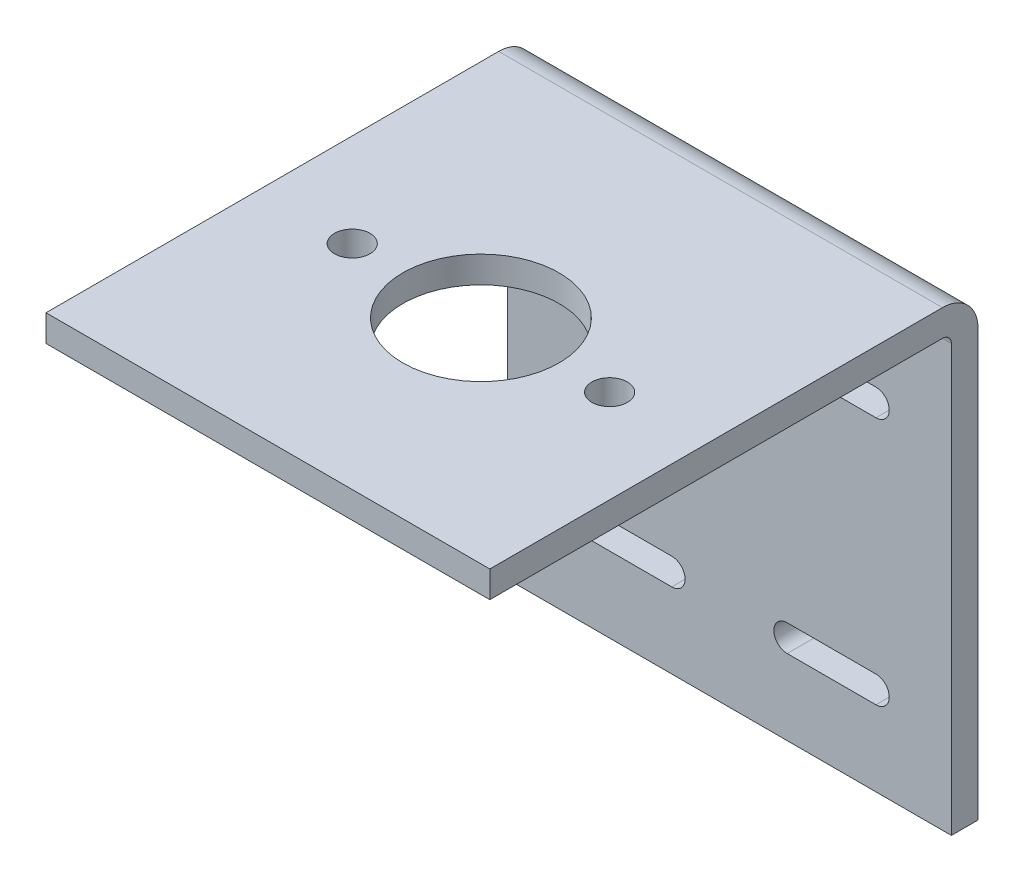
ISO-10303-21;
HEADER;
FILE_DESCRIPTION(('STEP AP214'),'2;1');
FILE_NAME('part.step','',(''),(''),'','','');
FILE_SCHEMA(('AUTOMOTIVE_DESIGN { 1 0 10303 214 1 1 1 1 }'));
ENDSEC;
DATA;
#1=APPLICATION_CONTEXT('core data for automotive mechanical design processes');
#2=APPLICATION_PROTOCOL_DEFINITION('international standard','automotive_design',2000,#1);
#3=PRODUCT_CONTEXT('',#1,'mechanical');
#4=PRODUCT('Part','Part','',(#3));
#5=PRODUCT_RELATED_PRODUCT_CATEGORY('part','',(#4));
#6=PRODUCT_DEFINITION_FORMATION('','',#4);
#7=PRODUCT_DEFINITION_CONTEXT('part definition',#1,'design');
#8=PRODUCT_DEFINITION('design','',#6,#7);
#9=PRODUCT_DEFINITION_SHAPE('','',#8);
#10=(LENGTH_UNIT() NAMED_UNIT(*) SI_UNIT(.MILLI.,.METRE.));
#11=(NAMED_UNIT(*) PLANE_ANGLE_UNIT() SI_UNIT($,.RADIAN.));
#12=(NAMED_UNIT(*) SI_UNIT($,.STERADIAN.) SOLID_ANGLE_UNIT());
#13=UNCERTAINTY_MEASURE_WITH_UNIT(LENGTH_MEASURE(1.E-05),#10,'distance_accuracy_value','');
#14=(GEOMETRIC_REPRESENTATION_CONTEXT(3) GLOBAL_UNCERTAINTY_ASSIGNED_CONTEXT((#13)) GLOBAL_UNIT_ASSIGNED_CONTEXT((#10,
#11,#12)) REPRESENTATION_CONTEXT('',''));
#15=CARTESIAN_POINT('',(0.,0.,0.));
#16=DIRECTION('',(0.,0.,1.));
#17=DIRECTION('',(1.,0.,0.));
#18=AXIS2_PLACEMENT_3D('',#15,#16,#17);
#19=CARTESIAN_POINT('',(0.,0.,3.));
#20=DIRECTION('',(0.,0.,-1.));
#21=DIRECTION('',(-1.,0.,0.));
#22=AXIS2_PLACEMENT_3D('',#19,#20,#21);
#23=PLANE('',#22);
#24=DIRECTION('',(-1.,0.,0.));
#25=VECTOR('',#24,1.);
#26=CARTESIAN_POINT('',(41.5000000000001,39.5000000000002,3.));
#27=LINE('',#26,#25);
#28=CARTESIAN_POINT('',(41.5000000000001,39.5000000000002,3.));
#29=VERTEX_POINT('',#28);
#30=CARTESIAN_POINT('',(31.5000000000001,39.5,3.));
#31=VERTEX_POINT('',#30);
#32=EDGE_CURVE('E275',#29,#31,#27,.T.);
#33=ORIENTED_EDGE('',*,*,#32,.F.);
#34=CARTESIAN_POINT('',(41.5000000000001,38.0000000000002,3.));
#35=DIRECTION('',(0.,0.,1.));
#36=DIRECTION('',(-1.,0.,0.));
#37=AXIS2_PLACEMENT_3D('',#34,#35,#36);
#38=CIRCLE('',#37,1.5);
#39=CARTESIAN_POINT('',(41.5000000000001,36.5000000000002,3.));
#40=VERTEX_POINT('',#39);
#41=EDGE_CURVE('E58',#40,#29,#38,.T.);
#42=ORIENTED_EDGE('',*,*,#41,.F.);
#43=DIRECTION('',(1.,0.,0.));
#44=VECTOR('',#43,1.);
#45=CARTESIAN_POINT('',(41.5000000000001,36.5000000000002,3.));
#46=LINE('',#45,#44);
#47=CARTESIAN_POINT('',(31.5000000000001,36.5,3.));
#48=VERTEX_POINT('',#47);
#49=EDGE_CURVE('E259',#48,#40,#46,.T.);
#50=ORIENTED_EDGE('',*,*,#49,.F.);
#51=CARTESIAN_POINT('',(31.5000000000001,38.,3.));
#52=DIRECTION('',(0.,0.,1.));
#53=DIRECTION('',(-1.,0.,0.));
#54=AXIS2_PLACEMENT_3D('',#51,#52,#53);
#55=CIRCLE('',#54,1.5);
#56=EDGE_CURVE('E271',#31,#48,#55,.T.);
#57=ORIENTED_EDGE('',*,*,#56,.F.);
#58=EDGE_LOOP('',(#33,#42,#50,#57));
#59=FACE_BOUND('',#58,.T.);
#60=DIRECTION('',(1.,0.,0.));
#61=VECTOR('',#60,1.);
#62=CARTESIAN_POINT('',(8.5,8.49999999999999,3.));
#63=LINE('',#62,#61);
#64=CARTESIAN_POINT('',(8.5,8.49999999999999,3.));
#65=VERTEX_POINT('',#64);
#66=CARTESIAN_POINT('',(18.5,8.49999999999999,3.));
#67=VERTEX_POINT('',#66);
#68=EDGE_CURVE('E317',#65,#67,#63,.T.);
#69=ORIENTED_EDGE('',*,*,#68,.F.);
#70=CARTESIAN_POINT('',(8.5,9.99999999999999,3.));
#71=DIRECTION('',(0.,0.,1.));
#72=DIRECTION('',(-1.,0.,0.));
#73=AXIS2_PLACEMENT_3D('',#70,#71,#72);
#74=CIRCLE('',#73,1.5);
#75=CARTESIAN_POINT('',(8.5,11.5,3.));
#76=VERTEX_POINT('',#75);
#77=EDGE_CURVE('E66',#76,#65,#74,.T.);
#78=ORIENTED_EDGE('',*,*,#77,.F.);
#79=DIRECTION('',(-1.,0.,0.));
#80=VECTOR('',#79,1.);
#81=CARTESIAN_POINT('',(8.5,11.5,3.));
#82=LINE('',#81,#80);
#83=CARTESIAN_POINT('',(18.5,11.5,3.));
#84=VERTEX_POINT('',#83);
#85=EDGE_CURVE('E301',#84,#76,#82,.T.);
#86=ORIENTED_EDGE('',*,*,#85,.F.);
#87=CARTESIAN_POINT('',(18.5,9.99999999999999,3.));
#88=DIRECTION('',(0.,0.,1.));
#89=DIRECTION('',(-1.,0.,0.));
#90=AXIS2_PLACEMENT_3D('',#87,#88,#89);
#91=CIRCLE('',#90,1.5);
#92=EDGE_CURVE('E313',#67,#84,#91,.T.);
#93=ORIENTED_EDGE('',*,*,#92,.F.);
#94=EDGE_LOOP('',(#69,#78,#86,#93));
#95=FACE_BOUND('',#94,.T.);
#96=DIRECTION('',(-1.,0.,0.));
#97=VECTOR('',#96,1.);
#98=CARTESIAN_POINT('',(41.5000000000001,11.4999999999998,3.));
#99=LINE('',#98,#97);
#100=CARTESIAN_POINT('',(41.5000000000001,11.4999999999998,3.));
#101=VERTEX_POINT('',#100);
#102=CARTESIAN_POINT('',(31.5000000000001,11.5,3.));
#103=VERTEX_POINT('',#102);
#104=EDGE_CURVE('E233',#101,#103,#99,.T.);
#105=ORIENTED_EDGE('',*,*,#104,.F.);
#106=CARTESIAN_POINT('',(41.5000000000001,9.99999999999977,3.));
#107=DIRECTION('',(0.,0.,1.));
#108=DIRECTION('',(1.,0.,0.));
#109=AXIS2_PLACEMENT_3D('',#106,#107,#108);
#110=CIRCLE('',#109,1.5);
#111=CARTESIAN_POINT('',(41.5000000000001,8.49999999999977,3.));
#112=VERTEX_POINT('',#111);
#113=EDGE_CURVE('E209',#112,#101,#110,.T.);
#114=ORIENTED_EDGE('',*,*,#113,.F.);
#115=DIRECTION('',(1.,0.,0.));
#116=VECTOR('',#115,1.);
#117=CARTESIAN_POINT('',(41.5000000000001,8.49999999999977,3.));
#118=LINE('',#117,#116);
#119=CARTESIAN_POINT('',(31.5000000000001,8.49999999999999,3.));
#120=VERTEX_POINT('',#119);
#121=EDGE_CURVE('E220',#120,#112,#118,.T.);
#122=ORIENTED_EDGE('',*,*,#121,.F.);
#123=CARTESIAN_POINT('',(31.5000000000001,9.99999999999999,3.));
#124=DIRECTION('',(0.,0.,1.));
#125=DIRECTION('',(1.,0.,0.));
#126=AXIS2_PLACEMENT_3D('',#123,#124,#125);
#127=CIRCLE('',#126,1.5);
#128=EDGE_CURVE('E227',#103,#120,#127,.T.);
#129=ORIENTED_EDGE('',*,*,#128,.F.);
#130=EDGE_LOOP('',(#105,#114,#122,#129));
#131=FACE_BOUND('',#130,.T.);
#132=DIRECTION('',(1.,0.,0.));
#133=VECTOR('',#132,1.);
#134=CARTESIAN_POINT('',(8.5,36.5,3.));
#135=LINE('',#134,#133);
#136=CARTESIAN_POINT('',(8.5,36.5,3.));
#137=VERTEX_POINT('',#136);
#138=CARTESIAN_POINT('',(18.5,36.5,3.));
#139=VERTEX_POINT('',#138);
#140=EDGE_CURVE('E348',#137,#139,#135,.T.);
#141=ORIENTED_EDGE('',*,*,#140,.F.);
#142=CARTESIAN_POINT('',(8.5,38.,3.));
#143=DIRECTION('',(0.,0.,1.));
#144=DIRECTION('',(1.,0.,0.));
#145=AXIS2_PLACEMENT_3D('',#142,#143,#144);
#146=CIRCLE('',#145,1.5);
#147=CARTESIAN_POINT('',(8.5,39.5,3.));
#148=VERTEX_POINT('',#147);
#149=EDGE_CURVE('E345',#148,#137,#146,.T.);
#150=ORIENTED_EDGE('',*,*,#149,.F.);
#151=DIRECTION('',(-1.,0.,0.));
#152=VECTOR('',#151,1.);
#153=CARTESIAN_POINT('',(8.5,39.5,3.));
#154=LINE('',#153,#152);
#155=CARTESIAN_POINT('',(18.5,39.5,3.));
#156=VERTEX_POINT('',#155);
#157=EDGE_CURVE('E356',#156,#148,#154,.T.);
#158=ORIENTED_EDGE('',*,*,#157,.F.);
#159=CARTESIAN_POINT('',(18.5,38.,3.));
#160=DIRECTION('',(0.,0.,1.));
#161=DIRECTION('',(1.,0.,0.));
#162=AXIS2_PLACEMENT_3D('',#159,#160,#161);
#163=CIRCLE('',#162,1.5);
#164=EDGE_CURVE('E352',#139,#156,#163,.T.);
#165=ORIENTED_EDGE('',*,*,#164,.F.);
#166=EDGE_LOOP('',(#141,#150,#158,#165));
#167=FACE_BOUND('',#166,.T.);
#168=DIRECTION('',(0.,1.,0.));
#169=VECTOR('',#168,1.);
#170=CARTESIAN_POINT('',(50.,0.,3.));
#171=LINE('',#170,#169);
#172=CARTESIAN_POINT('',(50.,0.,3.));
#173=VERTEX_POINT('',#172);
#174=CARTESIAN_POINT('',(50.,48.,3.));
#175=VERTEX_POINT('',#174);
#176=EDGE_CURVE('E432',#173,#175,#171,.T.);
#177=ORIENTED_EDGE('',*,*,#176,.T.);
#178=DIRECTION('',(1.,0.,0.));
#179=VECTOR('',#178,1.);
#180=CARTESIAN_POINT('',(0.,48.,3.));
#181=LINE('',#180,#179);
#182=CARTESIAN_POINT('',(0.,48.,3.));
#183=VERTEX_POINT('',#182);
#184=EDGE_CURVE('E477',#175,#183,#181,.F.);
#185=ORIENTED_EDGE('',*,*,#184,.T.);
#186=DIRECTION('',(0.,-1.,0.));
#187=VECTOR('',#186,1.);
#188=CARTESIAN_POINT('',(0.,0.,3.));
#189=LINE('',#188,#187);
#190=CARTESIAN_POINT('',(0.,0.,3.));
#191=VERTEX_POINT('',#190);
#192=EDGE_CURVE('E425',#183,#191,#189,.T.);
#193=ORIENTED_EDGE('',*,*,#192,.T.);
#194=DIRECTION('',(1.,0.,0.));
#195=VECTOR('',#194,1.);
#196=CARTESIAN_POINT('',(0.,0.,3.));
#197=LINE('',#196,#195);
#198=EDGE_CURVE('E428',#191,#173,#197,.T.);
#199=ORIENTED_EDGE('',*,*,#198,.T.);
#200=EDGE_LOOP('',(#177,#185,#193,#199));
#201=FACE_BOUND('',#200,.T.);
#202=ADVANCED_FACE('F42',(#59,#95,#131,#167,#201),#23,.F.);
#203=CARTESIAN_POINT('',(0.,0.,3.));
#204=DIRECTION('',(1.,0.,0.));
#205=DIRECTION('',(0.,0.,-1.));
#206=AXIS2_PLACEMENT_3D('',#203,#204,#205);
#207=PLANE('',#206);
#208=DIRECTION('',(0.,0.,-1.));
#209=VECTOR('',#208,1.);
#210=CARTESIAN_POINT('',(0.,52.,3.));
#211=LINE('',#210,#209);
#212=CARTESIAN_POINT('',(0.,52.,55.));
#213=VERTEX_POINT('',#212);
#214=CARTESIAN_POINT('',(0.,52.,4.));
#215=VERTEX_POINT('',#214);
#216=EDGE_CURVE('E436',#213,#215,#211,.T.);
#217=ORIENTED_EDGE('',*,*,#216,.T.);
#218=CARTESIAN_POINT('',(0.,48.,4.));
#219=DIRECTION('',(1.,0.,0.));
#220=DIRECTION('',(0.,0.,-1.));
#221=AXIS2_PLACEMENT_3D('',#218,#219,#220);
#222=CIRCLE('',#221,4.);
#223=CARTESIAN_POINT('',(0.,48.,0.));
#224=VERTEX_POINT('',#223);
#225=EDGE_CURVE('E464',#215,#224,#222,.F.);
#226=ORIENTED_EDGE('',*,*,#225,.T.);
#227=DIRECTION('',(0.,-1.,0.));
#228=VECTOR('',#227,1.);
#229=CARTESIAN_POINT('',(0.,0.,0.));
#230=LINE('',#229,#228);
#231=CARTESIAN_POINT('',(0.,0.,0.));
#232=VERTEX_POINT('',#231);
#233=EDGE_CURVE('E424',#224,#232,#230,.T.);
#234=ORIENTED_EDGE('',*,*,#233,.T.);
#235=DIRECTION('',(0.,0.,-1.));
#236=VECTOR('',#235,1.);
#237=CARTESIAN_POINT('',(0.,0.,3.));
#238=LINE('',#237,#236);
#239=EDGE_CURVE('E456',#191,#232,#238,.T.);
#240=ORIENTED_EDGE('',*,*,#239,.F.);
#241=ORIENTED_EDGE('',*,*,#192,.F.);
#242=CARTESIAN_POINT('',(0.,48.,4.));
#243=DIRECTION('',(1.,0.,0.));
#244=DIRECTION('',(0.,0.,-1.));
#245=AXIS2_PLACEMENT_3D('',#242,#243,#244);
#246=CIRCLE('',#245,1.);
#247=CARTESIAN_POINT('',(0.,49.,4.00000000000001));
#248=VERTEX_POINT('',#247);
#249=EDGE_CURVE('E11',#183,#248,#246,.T.);
#250=ORIENTED_EDGE('',*,*,#249,.T.);
#251=DIRECTION('',(0.,0.,-1.));
#252=VECTOR('',#251,1.);
#253=CARTESIAN_POINT('',(0.,49.,55.));
#254=LINE('',#253,#252);
#255=CARTESIAN_POINT('',(0.,49.,55.));
#256=VERTEX_POINT('',#255);
#257=EDGE_CURVE('E420',#256,#248,#254,.T.);
#258=ORIENTED_EDGE('',*,*,#257,.F.);
#259=DIRECTION('',(0.,-1.,0.));
#260=VECTOR('',#259,1.);
#261=CARTESIAN_POINT('',(0.,52.,55.));
#262=LINE('',#261,#260);
#263=EDGE_CURVE('E387',#213,#256,#262,.T.);
#264=ORIENTED_EDGE('',*,*,#263,.F.);
#265=EDGE_LOOP('',(#217,#226,#234,#240,#241,#250,#258,#264));
#266=FACE_BOUND('',#265,.T.);
#267=ADVANCED_FACE('F495',(#266),#207,.F.);
#268=CARTESIAN_POINT('',(0.,0.,3.));
#269=DIRECTION('',(0.,1.,0.));
#270=DIRECTION('',(0.,0.,1.));
#271=AXIS2_PLACEMENT_3D('',#268,#269,#270);
#272=PLANE('',#271);
#273=DIRECTION('',(1.,0.,0.));
#274=VECTOR('',#273,1.);
#275=CARTESIAN_POINT('',(0.,0.,0.));
#276=LINE('',#275,#274);
#277=CARTESIAN_POINT('',(50.,0.,0.));
#278=VERTEX_POINT('',#277);
#279=EDGE_CURVE('E439',#232,#278,#276,.T.);
#280=ORIENTED_EDGE('',*,*,#279,.T.);
#281=DIRECTION('',(0.,0.,-1.));
#282=VECTOR('',#281,1.);
#283=CARTESIAN_POINT('',(50.,0.,3.));
#284=LINE('',#283,#282);
#285=EDGE_CURVE('E452',#173,#278,#284,.T.);
#286=ORIENTED_EDGE('',*,*,#285,.F.);
#287=ORIENTED_EDGE('',*,*,#198,.F.);
#288=ORIENTED_EDGE('',*,*,#239,.T.);
#289=EDGE_LOOP('',(#280,#286,#287,#288));
#290=FACE_BOUND('',#289,.T.);
#291=ADVANCED_FACE('F516',(#290),#272,.F.);
#292=CARTESIAN_POINT('',(50.,0.,3.));
#293=DIRECTION('',(-1.,0.,0.));
#294=DIRECTION('',(0.,0.,1.));
#295=AXIS2_PLACEMENT_3D('',#292,#293,#294);
#296=PLANE('',#295);
#297=DIRECTION('',(0.,1.,0.));
#298=VECTOR('',#297,1.);
#299=CARTESIAN_POINT('',(50.,0.,0.));
#300=LINE('',#299,#298);
#301=CARTESIAN_POINT('',(50.,48.,0.));
#302=VERTEX_POINT('',#301);
#303=EDGE_CURVE('E429',#278,#302,#300,.T.);
#304=ORIENTED_EDGE('',*,*,#303,.T.);
#305=CARTESIAN_POINT('',(50.,48.,4.));
#306=DIRECTION('',(-1.,0.,0.));
#307=DIRECTION('',(0.,0.,1.));
#308=AXIS2_PLACEMENT_3D('',#305,#306,#307);
#309=CIRCLE('',#308,4.);
#310=CARTESIAN_POINT('',(50.,52.,4.));
#311=VERTEX_POINT('',#310);
#312=EDGE_CURVE('E470',#302,#311,#309,.F.);
#313=ORIENTED_EDGE('',*,*,#312,.T.);
#314=DIRECTION('',(0.,0.,-1.));
#315=VECTOR('',#314,1.);
#316=CARTESIAN_POINT('',(50.,52.,3.));
#317=LINE('',#316,#315);
#318=CARTESIAN_POINT('',(50.,52.,55.));
#319=VERTEX_POINT('',#318);
#320=EDGE_CURVE('E448',#319,#311,#317,.T.);
#321=ORIENTED_EDGE('',*,*,#320,.F.);
#322=DIRECTION('',(0.,1.,0.));
#323=VECTOR('',#322,1.);
#324=CARTESIAN_POINT('',(50.,52.,55.));
#325=LINE('',#324,#323);
#326=CARTESIAN_POINT('',(50.,49.,55.));
#327=VERTEX_POINT('',#326);
#328=EDGE_CURVE('E408',#327,#319,#325,.T.);
#329=ORIENTED_EDGE('',*,*,#328,.F.);
#330=DIRECTION('',(0.,0.,-1.));
#331=VECTOR('',#330,1.);
#332=CARTESIAN_POINT('',(50.,49.,55.));
#333=LINE('',#332,#331);
#334=CARTESIAN_POINT('',(50.,49.,4.00000000000001));
#335=VERTEX_POINT('',#334);
#336=EDGE_CURVE('E416',#327,#335,#333,.T.);
#337=ORIENTED_EDGE('',*,*,#336,.T.);
#338=CARTESIAN_POINT('',(50.,48.,4.));
#339=DIRECTION('',(-1.,0.,0.));
#340=DIRECTION('',(0.,0.,1.));
#341=AXIS2_PLACEMENT_3D('',#338,#339,#340);
#342=CIRCLE('',#341,1.);
#343=EDGE_CURVE('E51',#335,#175,#342,.T.);
#344=ORIENTED_EDGE('',*,*,#343,.T.);
#345=ORIENTED_EDGE('',*,*,#176,.F.);
#346=ORIENTED_EDGE('',*,*,#285,.T.);
#347=EDGE_LOOP('',(#304,#313,#321,#329,#337,#344,#345,#346));
#348=FACE_BOUND('',#347,.T.);
#349=ADVANCED_FACE('F482',(#348),#296,.F.);
#350=CARTESIAN_POINT('',(0.,52.,3.));
#351=DIRECTION('',(0.,-1.,0.));
#352=DIRECTION('',(0.,0.,-1.));
#353=AXIS2_PLACEMENT_3D('',#350,#351,#352);
#354=PLANE('',#353);
#355=CARTESIAN_POINT('',(10.5,52.,31.));
#356=DIRECTION('',(0.,1.,0.));
#357=DIRECTION('',(0.,0.,1.));
#358=AXIS2_PLACEMENT_3D('',#355,#356,#357);
#359=CIRCLE('',#358,2.00000000000001);
#360=CARTESIAN_POINT('',(10.5,52.,33.));
#361=VERTEX_POINT('',#360);
#362=EDGE_CURVE('E378',#361,#361,#359,.T.);
#363=ORIENTED_EDGE('',*,*,#362,.F.);
#364=EDGE_LOOP('',(#363));
#365=FACE_BOUND('',#364,.T.);
#366=CARTESIAN_POINT('',(39.5,52.,31.));
#367=DIRECTION('',(0.,1.,0.));
#368=DIRECTION('',(0.,0.,1.));
#369=AXIS2_PLACEMENT_3D('',#366,#367,#368);
#370=CIRCLE('',#369,2.00000000000001);
#371=CARTESIAN_POINT('',(39.5,52.,33.));
#372=VERTEX_POINT('',#371);
#373=EDGE_CURVE('E383',#372,#372,#370,.T.);
#374=ORIENTED_EDGE('',*,*,#373,.F.);
#375=EDGE_LOOP('',(#374));
#376=FACE_BOUND('',#375,.T.);
#377=CARTESIAN_POINT('',(25.,52.,31.));
#378=DIRECTION('',(0.,1.,0.));
#379=DIRECTION('',(0.,0.,1.));
#380=AXIS2_PLACEMENT_3D('',#377,#378,#379);
#381=CIRCLE('',#380,8.8);
#382=CARTESIAN_POINT('',(25.,52.,39.8));
#383=VERTEX_POINT('',#382);
#384=EDGE_CURVE('E392',#383,#383,#381,.T.);
#385=ORIENTED_EDGE('',*,*,#384,.F.);
#386=EDGE_LOOP('',(#385));
#387=FACE_BOUND('',#386,.T.);
#388=ORIENTED_EDGE('',*,*,#320,.T.);
#389=DIRECTION('',(-1.,0.,0.));
#390=VECTOR('',#389,1.);
#391=CARTESIAN_POINT('',(0.,52.,4.));
#392=LINE('',#391,#390);
#393=EDGE_CURVE('E460',#311,#215,#392,.T.);
#394=ORIENTED_EDGE('',*,*,#393,.T.);
#395=ORIENTED_EDGE('',*,*,#216,.F.);
#396=DIRECTION('',(-1.,0.,0.));
#397=VECTOR('',#396,1.);
#398=CARTESIAN_POINT('',(0.,52.,55.));
#399=LINE('',#398,#397);
#400=EDGE_CURVE('E412',#319,#213,#399,.T.);
#401=ORIENTED_EDGE('',*,*,#400,.F.);
#402=EDGE_LOOP('',(#388,#394,#395,#401));
#403=FACE_BOUND('',#402,.T.);
#404=ADVANCED_FACE('F505',(#365,#376,#387,#403),#354,.F.);
#405=CARTESIAN_POINT('',(0.,0.,0.));
#406=DIRECTION('',(0.,0.,-1.));
#407=DIRECTION('',(-1.,0.,0.));
#408=AXIS2_PLACEMENT_3D('',#405,#406,#407);
#409=PLANE('',#408);
#410=CARTESIAN_POINT('',(41.5000000000001,38.0000000000002,0.));
#411=DIRECTION('',(0.,0.,-1.));
#412=DIRECTION('',(-1.,0.,0.));
#413=AXIS2_PLACEMENT_3D('',#410,#411,#412);
#414=CIRCLE('',#413,1.5);
#415=CARTESIAN_POINT('',(41.5000000000001,36.5000000000002,0.));
#416=VERTEX_POINT('',#415);
#417=CARTESIAN_POINT('',(41.5000000000001,39.5000000000002,0.));
#418=VERTEX_POINT('',#417);
#419=EDGE_CURVE('E281',#416,#418,#414,.F.);
#420=ORIENTED_EDGE('',*,*,#419,.T.);
#421=DIRECTION('',(-1.,0.,0.));
#422=VECTOR('',#421,1.);
#423=CARTESIAN_POINT('',(41.5000000000001,39.5000000000002,0.));
#424=LINE('',#423,#422);
#425=CARTESIAN_POINT('',(31.5000000000001,39.5,0.));
#426=VERTEX_POINT('',#425);
#427=EDGE_CURVE('E250',#418,#426,#424,.T.);
#428=ORIENTED_EDGE('',*,*,#427,.T.);
#429=CARTESIAN_POINT('',(31.5000000000001,38.,0.));
#430=DIRECTION('',(0.,0.,-1.));
#431=DIRECTION('',(-1.,0.,0.));
#432=AXIS2_PLACEMENT_3D('',#429,#430,#431);
#433=CIRCLE('',#432,1.5);
#434=CARTESIAN_POINT('',(31.5000000000001,36.5,0.));
#435=VERTEX_POINT('',#434);
#436=EDGE_CURVE('E289',#426,#435,#433,.F.);
#437=ORIENTED_EDGE('',*,*,#436,.T.);
#438=DIRECTION('',(1.,0.,0.));
#439=VECTOR('',#438,1.);
#440=CARTESIAN_POINT('',(41.5000000000001,36.5000000000002,0.));
#441=LINE('',#440,#439);
#442=EDGE_CURVE('E285',#435,#416,#441,.T.);
#443=ORIENTED_EDGE('',*,*,#442,.T.);
#444=EDGE_LOOP('',(#420,#428,#437,#443));
#445=FACE_BOUND('',#444,.T.);
#446=CARTESIAN_POINT('',(8.5,9.99999999999999,0.));
#447=DIRECTION('',(0.,0.,-1.));
#448=DIRECTION('',(-1.,0.,0.));
#449=AXIS2_PLACEMENT_3D('',#446,#447,#448);
#450=CIRCLE('',#449,1.5);
#451=CARTESIAN_POINT('',(8.5,11.5,0.));
#452=VERTEX_POINT('',#451);
#453=CARTESIAN_POINT('',(8.5,8.49999999999999,0.));
#454=VERTEX_POINT('',#453);
#455=EDGE_CURVE('E323',#452,#454,#450,.F.);
#456=ORIENTED_EDGE('',*,*,#455,.T.);
#457=DIRECTION('',(1.,0.,0.));
#458=VECTOR('',#457,1.);
#459=CARTESIAN_POINT('',(8.5,8.49999999999999,0.));
#460=LINE('',#459,#458);
#461=CARTESIAN_POINT('',(18.5,8.49999999999999,0.));
#462=VERTEX_POINT('',#461);
#463=EDGE_CURVE('E249',#454,#462,#460,.T.);
#464=ORIENTED_EDGE('',*,*,#463,.T.);
#465=CARTESIAN_POINT('',(18.5,9.99999999999999,0.));
#466=DIRECTION('',(0.,0.,-1.));
#467=DIRECTION('',(-1.,0.,0.));
#468=AXIS2_PLACEMENT_3D('',#465,#466,#467);
#469=CIRCLE('',#468,1.5);
#470=CARTESIAN_POINT('',(18.5,11.5,0.));
#471=VERTEX_POINT('',#470);
#472=EDGE_CURVE('E255',#462,#471,#469,.F.);
#473=ORIENTED_EDGE('',*,*,#472,.T.);
#474=DIRECTION('',(-1.,0.,0.));
#475=VECTOR('',#474,1.);
#476=CARTESIAN_POINT('',(8.5,11.5,0.));
#477=LINE('',#476,#475);
#478=EDGE_CURVE('E327',#471,#452,#477,.T.);
#479=ORIENTED_EDGE('',*,*,#478,.T.);
#480=EDGE_LOOP('',(#456,#464,#473,#479));
#481=FACE_BOUND('',#480,.T.);
#482=CARTESIAN_POINT('',(41.5000000000001,9.99999999999977,0.));
#483=DIRECTION('',(0.,0.,-1.));
#484=DIRECTION('',(-1.,0.,0.));
#485=AXIS2_PLACEMENT_3D('',#482,#483,#484);
#486=CIRCLE('',#485,1.5);
#487=CARTESIAN_POINT('',(41.5000000000001,8.49999999999977,0.));
#488=VERTEX_POINT('',#487);
#489=CARTESIAN_POINT('',(41.5000000000001,11.4999999999998,0.));
#490=VERTEX_POINT('',#489);
#491=EDGE_CURVE('E212',#488,#490,#486,.F.);
#492=ORIENTED_EDGE('',*,*,#491,.T.);
#493=DIRECTION('',(-1.,0.,0.));
#494=VECTOR('',#493,1.);
#495=CARTESIAN_POINT('',(41.5000000000001,11.4999999999998,0.));
#496=LINE('',#495,#494);
#497=CARTESIAN_POINT('',(31.5000000000001,11.5,0.));
#498=VERTEX_POINT('',#497);
#499=EDGE_CURVE('E217',#490,#498,#496,.T.);
#500=ORIENTED_EDGE('',*,*,#499,.T.);
#501=CARTESIAN_POINT('',(31.5000000000001,9.99999999999999,0.));
#502=DIRECTION('',(0.,0.,-1.));
#503=DIRECTION('',(-1.,0.,0.));
#504=AXIS2_PLACEMENT_3D('',#501,#502,#503);
#505=CIRCLE('',#504,1.5);
#506=CARTESIAN_POINT('',(31.5000000000001,8.49999999999999,0.));
#507=VERTEX_POINT('',#506);
#508=EDGE_CURVE('E245',#498,#507,#505,.F.);
#509=ORIENTED_EDGE('',*,*,#508,.T.);
#510=DIRECTION('',(1.,0.,0.));
#511=VECTOR('',#510,1.);
#512=CARTESIAN_POINT('',(41.5000000000001,8.49999999999977,0.));
#513=LINE('',#512,#511);
#514=EDGE_CURVE('E238',#507,#488,#513,.T.);
#515=ORIENTED_EDGE('',*,*,#514,.T.);
#516=EDGE_LOOP('',(#492,#500,#509,#515));
#517=FACE_BOUND('',#516,.T.);
#518=CARTESIAN_POINT('',(8.5,38.,0.));
#519=DIRECTION('',(0.,0.,-1.));
#520=DIRECTION('',(-1.,0.,0.));
#521=AXIS2_PLACEMENT_3D('',#518,#519,#520);
#522=CIRCLE('',#521,1.5);
#523=CARTESIAN_POINT('',(8.5,39.5,0.));
#524=VERTEX_POINT('',#523);
#525=CARTESIAN_POINT('',(8.5,36.5,0.));
#526=VERTEX_POINT('',#525);
#527=EDGE_CURVE('E341',#524,#526,#522,.F.);
#528=ORIENTED_EDGE('',*,*,#527,.T.);
#529=DIRECTION('',(1.,0.,0.));
#530=VECTOR('',#529,1.);
#531=CARTESIAN_POINT('',(8.5,36.5,0.));
#532=LINE('',#531,#530);
#533=CARTESIAN_POINT('',(18.5,36.5,0.));
#534=VERTEX_POINT('',#533);
#535=EDGE_CURVE('E364',#526,#534,#532,.T.);
#536=ORIENTED_EDGE('',*,*,#535,.T.);
#537=CARTESIAN_POINT('',(18.5,38.,0.));
#538=DIRECTION('',(0.,0.,-1.));
#539=DIRECTION('',(-1.,0.,0.));
#540=AXIS2_PLACEMENT_3D('',#537,#538,#539);
#541=CIRCLE('',#540,1.5);
#542=CARTESIAN_POINT('',(18.5,39.5,0.));
#543=VERTEX_POINT('',#542);
#544=EDGE_CURVE('E293',#534,#543,#541,.F.);
#545=ORIENTED_EDGE('',*,*,#544,.T.);
#546=DIRECTION('',(-1.,0.,0.));
#547=VECTOR('',#546,1.);
#548=CARTESIAN_POINT('',(8.5,39.5,0.));
#549=LINE('',#548,#547);
#550=EDGE_CURVE('E337',#543,#524,#549,.T.);
#551=ORIENTED_EDGE('',*,*,#550,.T.);
#552=EDGE_LOOP('',(#528,#536,#545,#551));
#553=FACE_BOUND('',#552,.T.);
#554=ORIENTED_EDGE('',*,*,#233,.F.);
#555=DIRECTION('',(-1.,0.,0.));
#556=VECTOR('',#555,1.);
#557=CARTESIAN_POINT('',(50.,48.,0.));
#558=LINE('',#557,#556);
#559=EDGE_CURVE('E467',#224,#302,#558,.F.);
#560=ORIENTED_EDGE('',*,*,#559,.T.);
#561=ORIENTED_EDGE('',*,*,#303,.F.);
#562=ORIENTED_EDGE('',*,*,#279,.F.);
#563=EDGE_LOOP('',(#554,#560,#561,#562));
#564=FACE_BOUND('',#563,.T.);
#565=ADVANCED_FACE('F513',(#445,#481,#517,#553,#564),#409,.T.);
#566=CARTESIAN_POINT('',(0.,49.,55.));
#567=DIRECTION('',(0.,1.,0.));
#568=DIRECTION('',(0.,0.,1.));
#569=AXIS2_PLACEMENT_3D('',#566,#567,#568);
#570=PLANE('',#569);
#571=CARTESIAN_POINT('',(10.5,49.,31.));
#572=DIRECTION('',(0.,1.,0.));
#573=DIRECTION('',(0.,0.,1.));
#574=AXIS2_PLACEMENT_3D('',#571,#572,#573);
#575=CIRCLE('',#574,2.00000000000001);
#576=CARTESIAN_POINT('',(10.5,49.,33.));
#577=VERTEX_POINT('',#576);
#578=EDGE_CURVE('E382',#577,#577,#575,.F.);
#579=ORIENTED_EDGE('',*,*,#578,.F.);
#580=EDGE_LOOP('',(#579));
#581=FACE_BOUND('',#580,.T.);
#582=CARTESIAN_POINT('',(39.5,49.,31.));
#583=DIRECTION('',(0.,1.,0.));
#584=DIRECTION('',(0.,0.,1.));
#585=AXIS2_PLACEMENT_3D('',#582,#583,#584);
#586=CIRCLE('',#585,2.00000000000001);
#587=CARTESIAN_POINT('',(39.5,49.,33.));
#588=VERTEX_POINT('',#587);
#589=EDGE_CURVE('E388',#588,#588,#586,.F.);
#590=ORIENTED_EDGE('',*,*,#589,.F.);
#591=EDGE_LOOP('',(#590));
#592=FACE_BOUND('',#591,.T.);
#593=CARTESIAN_POINT('',(25.,49.,31.));
#594=DIRECTION('',(0.,1.,0.));
#595=DIRECTION('',(0.,0.,1.));
#596=AXIS2_PLACEMENT_3D('',#593,#594,#595);
#597=CIRCLE('',#596,8.8);
#598=CARTESIAN_POINT('',(25.,49.,39.8));
#599=VERTEX_POINT('',#598);
#600=EDGE_CURVE('E377',#599,#599,#597,.F.);
#601=ORIENTED_EDGE('',*,*,#600,.F.);
#602=EDGE_LOOP('',(#601));
#603=FACE_BOUND('',#602,.T.);
#604=ORIENTED_EDGE('',*,*,#257,.T.);
#605=DIRECTION('',(1.,0.,0.));
#606=VECTOR('',#605,1.);
#607=CARTESIAN_POINT('',(50.,49.,4.));
#608=LINE('',#607,#606);
#609=EDGE_CURVE('E473',#248,#335,#608,.T.);
#610=ORIENTED_EDGE('',*,*,#609,.T.);
#611=ORIENTED_EDGE('',*,*,#336,.F.);
#612=DIRECTION('',(1.,0.,0.));
#613=VECTOR('',#612,1.);
#614=CARTESIAN_POINT('',(0.,49.,55.));
#615=LINE('',#614,#613);
#616=EDGE_CURVE('E405',#256,#327,#615,.T.);
#617=ORIENTED_EDGE('',*,*,#616,.F.);
#618=EDGE_LOOP('',(#604,#610,#611,#617));
#619=FACE_BOUND('',#618,.T.);
#620=ADVANCED_FACE('F499',(#581,#592,#603,#619),#570,.F.);
#621=CARTESIAN_POINT('',(0.,0.,55.));
#622=DIRECTION('',(0.,0.,1.));
#623=DIRECTION('',(1.,0.,0.));
#624=AXIS2_PLACEMENT_3D('',#621,#622,#623);
#625=PLANE('',#624);
#626=ORIENTED_EDGE('',*,*,#263,.T.);
#627=ORIENTED_EDGE('',*,*,#616,.T.);
#628=ORIENTED_EDGE('',*,*,#328,.T.);
#629=ORIENTED_EDGE('',*,*,#400,.T.);
#630=EDGE_LOOP('',(#626,#627,#628,#629));
#631=FACE_BOUND('',#630,.T.);
#632=ADVANCED_FACE('F501',(#631),#625,.T.);
#633=CARTESIAN_POINT('',(0.,48.,4.));
#634=DIRECTION('',(1.,0.,0.));
#635=DIRECTION('',(0.,0.,-1.));
#636=AXIS2_PLACEMENT_3D('',#633,#634,#635);
#637=CYLINDRICAL_SURFACE('',#636,4.);
#638=ORIENTED_EDGE('',*,*,#312,.F.);
#639=ORIENTED_EDGE('',*,*,#559,.F.);
#640=ORIENTED_EDGE('',*,*,#225,.F.);
#641=ORIENTED_EDGE('',*,*,#393,.F.);
#642=EDGE_LOOP('',(#638,#639,#640,#641));
#643=FACE_BOUND('',#642,.T.);
#644=ADVANCED_FACE('F509',(#643),#637,.T.);
#645=CARTESIAN_POINT('',(0.,48.,4.));
#646=DIRECTION('',(-1.,0.,0.));
#647=DIRECTION('',(0.,0.,1.));
#648=AXIS2_PLACEMENT_3D('',#645,#646,#647);
#649=CYLINDRICAL_SURFACE('',#648,1.);
#650=ORIENTED_EDGE('',*,*,#249,.F.);
#651=ORIENTED_EDGE('',*,*,#184,.F.);
#652=ORIENTED_EDGE('',*,*,#343,.F.);
#653=ORIENTED_EDGE('',*,*,#609,.F.);
#654=EDGE_LOOP('',(#650,#651,#652,#653));
#655=FACE_BOUND('',#654,.T.);
#656=ADVANCED_FACE('F44',(#655),#649,.F.);
#657=CARTESIAN_POINT('',(25.,-0.001000000000001,31.));
#658=DIRECTION('',(0.,1.,0.));
#659=DIRECTION('',(0.,0.,1.));
#660=AXIS2_PLACEMENT_3D('',#657,#658,#659);
#661=CYLINDRICAL_SURFACE('',#660,8.8);
#662=ORIENTED_EDGE('',*,*,#384,.T.);
#663=EDGE_LOOP('',(#662));
#664=FACE_BOUND('',#663,.T.);
#665=ORIENTED_EDGE('',*,*,#600,.T.);
#666=EDGE_LOOP('',(#665));
#667=FACE_BOUND('',#666,.T.);
#668=ADVANCED_FACE('F550',(#664,#667),#661,.F.);
#669=CARTESIAN_POINT('',(39.5,-0.001000000000001,31.));
#670=DIRECTION('',(0.,1.,0.));
#671=DIRECTION('',(0.,0.,1.));
#672=AXIS2_PLACEMENT_3D('',#669,#670,#671);
#673=CYLINDRICAL_SURFACE('',#672,2.00000000000001);
#674=ORIENTED_EDGE('',*,*,#373,.T.);
#675=EDGE_LOOP('',(#674));
#676=FACE_BOUND('',#675,.T.);
#677=ORIENTED_EDGE('',*,*,#589,.T.);
#678=EDGE_LOOP('',(#677));
#679=FACE_BOUND('',#678,.T.);
#680=ADVANCED_FACE('F553',(#676,#679),#673,.F.);
#681=CARTESIAN_POINT('',(10.5,-0.001000000000001,31.));
#682=DIRECTION('',(0.,1.,0.));
#683=DIRECTION('',(0.,0.,1.));
#684=AXIS2_PLACEMENT_3D('',#681,#682,#683);
#685=CYLINDRICAL_SURFACE('',#684,2.00000000000001);
#686=ORIENTED_EDGE('',*,*,#362,.T.);
#687=EDGE_LOOP('',(#686));
#688=FACE_BOUND('',#687,.T.);
#689=ORIENTED_EDGE('',*,*,#578,.T.);
#690=EDGE_LOOP('',(#689));
#691=FACE_BOUND('',#690,.T.);
#692=ADVANCED_FACE('F567',(#688,#691),#685,.F.);
#693=CARTESIAN_POINT('',(8.5,38.,-0.00100000000000013));
#694=DIRECTION('',(0.,0.,1.));
#695=DIRECTION('',(1.,0.,0.));
#696=AXIS2_PLACEMENT_3D('',#693,#694,#695);
#697=CYLINDRICAL_SURFACE('',#696,1.5);
#698=DIRECTION('',(0.,0.,1.));
#699=VECTOR('',#698,1.);
#700=CARTESIAN_POINT('',(8.5,39.5,-0.00100000000000013));
#701=LINE('',#700,#699);
#702=EDGE_CURVE('E361',#524,#148,#701,.T.);
#703=ORIENTED_EDGE('',*,*,#702,.T.);
#704=ORIENTED_EDGE('',*,*,#149,.T.);
#705=DIRECTION('',(0.,0.,1.));
#706=VECTOR('',#705,1.);
#707=CARTESIAN_POINT('',(8.5,36.5,-0.00100000000000013));
#708=LINE('',#707,#706);
#709=EDGE_CURVE('E360',#526,#137,#708,.T.);
#710=ORIENTED_EDGE('',*,*,#709,.F.);
#711=ORIENTED_EDGE('',*,*,#527,.F.);
#712=EDGE_LOOP('',(#703,#704,#710,#711));
#713=FACE_BOUND('',#712,.T.);
#714=ADVANCED_FACE('F573',(#713),#697,.F.);
#715=CARTESIAN_POINT('',(8.5,39.5,-0.00100000000000013));
#716=DIRECTION('',(0.,1.,0.));
#717=DIRECTION('',(0.,0.,1.));
#718=AXIS2_PLACEMENT_3D('',#715,#716,#717);
#719=PLANE('',#718);
#720=DIRECTION('',(0.,0.,1.));
#721=VECTOR('',#720,1.);
#722=CARTESIAN_POINT('',(18.5,39.5,-0.00100000000000013));
#723=LINE('',#722,#721);
#724=EDGE_CURVE('E365',#543,#156,#723,.T.);
#725=ORIENTED_EDGE('',*,*,#724,.T.);
#726=ORIENTED_EDGE('',*,*,#157,.T.);
#727=ORIENTED_EDGE('',*,*,#702,.F.);
#728=ORIENTED_EDGE('',*,*,#550,.F.);
#729=EDGE_LOOP('',(#725,#726,#727,#728));
#730=FACE_BOUND('',#729,.T.);
#731=ADVANCED_FACE('F579',(#730),#719,.F.);
#732=CARTESIAN_POINT('',(18.5,38.,-0.00100000000000013));
#733=DIRECTION('',(0.,0.,1.));
#734=DIRECTION('',(1.,0.,0.));
#735=AXIS2_PLACEMENT_3D('',#732,#733,#734);
#736=CYLINDRICAL_SURFACE('',#735,1.5);
#737=DIRECTION('',(0.,0.,1.));
#738=VECTOR('',#737,1.);
#739=CARTESIAN_POINT('',(18.5,36.5,-0.00100000000000013));
#740=LINE('',#739,#738);
#741=EDGE_CURVE('E368',#534,#139,#740,.T.);
#742=ORIENTED_EDGE('',*,*,#741,.T.);
#743=ORIENTED_EDGE('',*,*,#164,.T.);
#744=ORIENTED_EDGE('',*,*,#724,.F.);
#745=ORIENTED_EDGE('',*,*,#544,.F.);
#746=EDGE_LOOP('',(#742,#743,#744,#745));
#747=FACE_BOUND('',#746,.T.);
#748=ADVANCED_FACE('F584',(#747),#736,.F.);
#749=CARTESIAN_POINT('',(8.5,36.5,-0.00100000000000013));
#750=DIRECTION('',(0.,-1.,0.));
#751=DIRECTION('',(0.,0.,-1.));
#752=AXIS2_PLACEMENT_3D('',#749,#750,#751);
#753=PLANE('',#752);
#754=ORIENTED_EDGE('',*,*,#709,.T.);
#755=ORIENTED_EDGE('',*,*,#140,.T.);
#756=ORIENTED_EDGE('',*,*,#741,.F.);
#757=ORIENTED_EDGE('',*,*,#535,.F.);
#758=EDGE_LOOP('',(#754,#755,#756,#757));
#759=FACE_BOUND('',#758,.T.);
#760=ADVANCED_FACE('F581',(#759),#753,.F.);
#761=CARTESIAN_POINT('',(41.5000000000001,9.99999999999977,-0.00100000000000013));
#762=DIRECTION('',(0.,0.,1.));
#763=DIRECTION('',(1.,0.,0.));
#764=AXIS2_PLACEMENT_3D('',#761,#762,#763);
#765=CYLINDRICAL_SURFACE('',#764,1.5);
#766=DIRECTION('',(0.,0.,1.));
#767=VECTOR('',#766,1.);
#768=CARTESIAN_POINT('',(41.5000000000001,8.49999999999977,-0.00100000000000013));
#769=LINE('',#768,#767);
#770=EDGE_CURVE('E204',#488,#112,#769,.T.);
#771=ORIENTED_EDGE('',*,*,#770,.T.);
#772=ORIENTED_EDGE('',*,*,#113,.T.);
#773=DIRECTION('',(0.,0.,1.));
#774=VECTOR('',#773,1.);
#775=CARTESIAN_POINT('',(41.5000000000001,11.4999999999998,-0.00100000000000013));
#776=LINE('',#775,#774);
#777=EDGE_CURVE('E228',#490,#101,#776,.T.);
#778=ORIENTED_EDGE('',*,*,#777,.F.);
#779=ORIENTED_EDGE('',*,*,#491,.F.);
#780=EDGE_LOOP('',(#771,#772,#778,#779));
#781=FACE_BOUND('',#780,.T.);
#782=ADVANCED_FACE('F206',(#781),#765,.F.);
#783=CARTESIAN_POINT('',(41.5000000000001,8.49999999999977,-0.00100000000000013));
#784=DIRECTION('',(0.,-1.,0.));
#785=DIRECTION('',(1.,0.,0.));
#786=AXIS2_PLACEMENT_3D('',#783,#784,#785);
#787=PLANE('',#786);
#788=DIRECTION('',(0.,0.,1.));
#789=VECTOR('',#788,1.);
#790=CARTESIAN_POINT('',(31.5000000000001,8.49999999999999,-0.00100000000000013));
#791=LINE('',#790,#789);
#792=EDGE_CURVE('E216',#507,#120,#791,.T.);
#793=ORIENTED_EDGE('',*,*,#792,.T.);
#794=ORIENTED_EDGE('',*,*,#121,.T.);
#795=ORIENTED_EDGE('',*,*,#770,.F.);
#796=ORIENTED_EDGE('',*,*,#514,.F.);
#797=EDGE_LOOP('',(#793,#794,#795,#796));
#798=FACE_BOUND('',#797,.T.);
#799=ADVANCED_FACE('F221',(#798),#787,.F.);
#800=CARTESIAN_POINT('',(31.5000000000001,9.99999999999999,-0.00100000000000013));
#801=DIRECTION('',(0.,0.,1.));
#802=DIRECTION('',(1.,0.,0.));
#803=AXIS2_PLACEMENT_3D('',#800,#801,#802);
#804=CYLINDRICAL_SURFACE('',#803,1.5);
#805=DIRECTION('',(0.,0.,1.));
#806=VECTOR('',#805,1.);
#807=CARTESIAN_POINT('',(31.5000000000001,11.5,-0.00100000000000013));
#808=LINE('',#807,#806);
#809=EDGE_CURVE('E866',#498,#103,#808,.T.);
#810=ORIENTED_EDGE('',*,*,#809,.T.);
#811=ORIENTED_EDGE('',*,*,#128,.T.);
#812=ORIENTED_EDGE('',*,*,#792,.F.);
#813=ORIENTED_EDGE('',*,*,#508,.F.);
#814=EDGE_LOOP('',(#810,#811,#812,#813));
#815=FACE_BOUND('',#814,.T.);
#816=ADVANCED_FACE('F625',(#815),#804,.F.);
#817=CARTESIAN_POINT('',(41.5000000000001,11.4999999999998,-0.00100000000000013));
#818=DIRECTION('',(0.,1.,0.));
#819=DIRECTION('',(-1.,0.,0.));
#820=AXIS2_PLACEMENT_3D('',#817,#818,#819);
#821=PLANE('',#820);
#822=ORIENTED_EDGE('',*,*,#777,.T.);
#823=ORIENTED_EDGE('',*,*,#104,.T.);
#824=ORIENTED_EDGE('',*,*,#809,.F.);
#825=ORIENTED_EDGE('',*,*,#499,.F.);
#826=EDGE_LOOP('',(#822,#823,#824,#825));
#827=FACE_BOUND('',#826,.T.);
#828=ADVANCED_FACE('F608',(#827),#821,.F.);
#829=CARTESIAN_POINT('',(8.5,9.99999999999999,-0.00100000000000013));
#830=DIRECTION('',(0.,0.,1.));
#831=DIRECTION('',(1.,0.,0.));
#832=AXIS2_PLACEMENT_3D('',#829,#830,#831);
#833=CYLINDRICAL_SURFACE('',#832,1.5);
#834=DIRECTION('',(0.,0.,1.));
#835=VECTOR('',#834,1.);
#836=CARTESIAN_POINT('',(8.5,11.5,-0.00100000000000013));
#837=LINE('',#836,#835);
#838=EDGE_CURVE('E297',#452,#76,#837,.T.);
#839=ORIENTED_EDGE('',*,*,#838,.T.);
#840=ORIENTED_EDGE('',*,*,#77,.T.);
#841=DIRECTION('',(0.,0.,1.));
#842=VECTOR('',#841,1.);
#843=CARTESIAN_POINT('',(8.5,8.49999999999999,-0.00100000000000013));
#844=LINE('',#843,#842);
#845=EDGE_CURVE('E298',#454,#65,#844,.T.);
#846=ORIENTED_EDGE('',*,*,#845,.F.);
#847=ORIENTED_EDGE('',*,*,#455,.F.);
#848=EDGE_LOOP('',(#839,#840,#846,#847));
#849=FACE_BOUND('',#848,.T.);
#850=ADVANCED_FACE('F596',(#849),#833,.F.);
#851=CARTESIAN_POINT('',(8.5,11.5,-0.00100000000000013));
#852=DIRECTION('',(0.,1.,0.));
#853=DIRECTION('',(0.,0.,1.));
#854=AXIS2_PLACEMENT_3D('',#851,#852,#853);
#855=PLANE('',#854);
#856=DIRECTION('',(0.,0.,1.));
#857=VECTOR('',#856,1.);
#858=CARTESIAN_POINT('',(18.5,11.5,-0.00100000000000013));
#859=LINE('',#858,#857);
#860=EDGE_CURVE('E305',#471,#84,#859,.T.);
#861=ORIENTED_EDGE('',*,*,#860,.T.);
#862=ORIENTED_EDGE('',*,*,#85,.T.);
#863=ORIENTED_EDGE('',*,*,#838,.F.);
#864=ORIENTED_EDGE('',*,*,#478,.F.);
#865=EDGE_LOOP('',(#861,#862,#863,#864));
#866=FACE_BOUND('',#865,.T.);
#867=ADVANCED_FACE('F592',(#866),#855,.F.);
#868=CARTESIAN_POINT('',(18.5,9.99999999999999,-0.00100000000000013));
#869=DIRECTION('',(0.,0.,1.));
#870=DIRECTION('',(1.,0.,0.));
#871=AXIS2_PLACEMENT_3D('',#868,#869,#870);
#872=CYLINDRICAL_SURFACE('',#871,1.5);
#873=DIRECTION('',(0.,0.,1.));
#874=VECTOR('',#873,1.);
#875=CARTESIAN_POINT('',(18.5,8.49999999999999,-0.00100000000000013));
#876=LINE('',#875,#874);
#877=EDGE_CURVE('E302',#462,#67,#876,.T.);
#878=ORIENTED_EDGE('',*,*,#877,.T.);
#879=ORIENTED_EDGE('',*,*,#92,.T.);
#880=ORIENTED_EDGE('',*,*,#860,.F.);
#881=ORIENTED_EDGE('',*,*,#472,.F.);
#882=EDGE_LOOP('',(#878,#879,#880,#881));
#883=FACE_BOUND('',#882,.T.);
#884=ADVANCED_FACE('F595',(#883),#872,.F.);
#885=CARTESIAN_POINT('',(8.5,8.49999999999999,-0.00100000000000013));
#886=DIRECTION('',(0.,-1.,0.));
#887=DIRECTION('',(0.,0.,-1.));
#888=AXIS2_PLACEMENT_3D('',#885,#886,#887);
#889=PLANE('',#888);
#890=ORIENTED_EDGE('',*,*,#845,.T.);
#891=ORIENTED_EDGE('',*,*,#68,.T.);
#892=ORIENTED_EDGE('',*,*,#877,.F.);
#893=ORIENTED_EDGE('',*,*,#463,.F.);
#894=EDGE_LOOP('',(#890,#891,#892,#893));
#895=FACE_BOUND('',#894,.T.);
#896=ADVANCED_FACE('F600',(#895),#889,.F.);
#897=CARTESIAN_POINT('',(41.5000000000001,38.0000000000002,-0.00100000000000013));
#898=DIRECTION('',(0.,0.,1.));
#899=DIRECTION('',(1.,0.,0.));
#900=AXIS2_PLACEMENT_3D('',#897,#898,#899);
#901=CYLINDRICAL_SURFACE('',#900,1.5);
#902=DIRECTION('',(0.,0.,1.));
#903=VECTOR('',#902,1.);
#904=CARTESIAN_POINT('',(41.5000000000001,36.5000000000002,-0.00100000000000013));
#905=LINE('',#904,#903);
#906=EDGE_CURVE('E254',#416,#40,#905,.T.);
#907=ORIENTED_EDGE('',*,*,#906,.T.);
#908=ORIENTED_EDGE('',*,*,#41,.T.);
#909=DIRECTION('',(0.,0.,1.));
#910=VECTOR('',#909,1.);
#911=CARTESIAN_POINT('',(41.5000000000001,39.5000000000002,-0.00100000000000013));
#912=LINE('',#911,#910);
#913=EDGE_CURVE('E256',#418,#29,#912,.T.);
#914=ORIENTED_EDGE('',*,*,#913,.F.);
#915=ORIENTED_EDGE('',*,*,#419,.F.);
#916=EDGE_LOOP('',(#907,#908,#914,#915));
#917=FACE_BOUND('',#916,.T.);
#918=ADVANCED_FACE('F604',(#917),#901,.F.);
#919=CARTESIAN_POINT('',(41.5000000000001,36.5000000000002,-0.00100000000000013));
#920=DIRECTION('',(0.,-1.,0.));
#921=DIRECTION('',(1.,0.,0.));
#922=AXIS2_PLACEMENT_3D('',#919,#920,#921);
#923=PLANE('',#922);
#924=DIRECTION('',(0.,0.,1.));
#925=VECTOR('',#924,1.);
#926=CARTESIAN_POINT('',(31.5000000000001,36.5,-0.00100000000000013));
#927=LINE('',#926,#925);
#928=EDGE_CURVE('E263',#435,#48,#927,.T.);
#929=ORIENTED_EDGE('',*,*,#928,.T.);
#930=ORIENTED_EDGE('',*,*,#49,.T.);
#931=ORIENTED_EDGE('',*,*,#906,.F.);
#932=ORIENTED_EDGE('',*,*,#442,.F.);
#933=EDGE_LOOP('',(#929,#930,#931,#932));
#934=FACE_BOUND('',#933,.T.);
#935=ADVANCED_FACE('F609',(#934),#923,.F.);
#936=CARTESIAN_POINT('',(31.5000000000001,38.,-0.00100000000000013));
#937=DIRECTION('',(0.,0.,1.));
#938=DIRECTION('',(1.,0.,0.));
#939=AXIS2_PLACEMENT_3D('',#936,#937,#938);
#940=CYLINDRICAL_SURFACE('',#939,1.5);
#941=DIRECTION('',(0.,0.,1.));
#942=VECTOR('',#941,1.);
#943=CARTESIAN_POINT('',(31.5000000000001,39.5,-0.00100000000000013));
#944=LINE('',#943,#942);
#945=EDGE_CURVE('E260',#426,#31,#944,.T.);
#946=ORIENTED_EDGE('',*,*,#945,.T.);
#947=ORIENTED_EDGE('',*,*,#56,.T.);
#948=ORIENTED_EDGE('',*,*,#928,.F.);
#949=ORIENTED_EDGE('',*,*,#436,.F.);
#950=EDGE_LOOP('',(#946,#947,#948,#949));
#951=FACE_BOUND('',#950,.T.);
#952=ADVANCED_FACE('F612',(#951),#940,.F.);
#953=CARTESIAN_POINT('',(41.5000000000001,39.5000000000002,-0.00100000000000013));
#954=DIRECTION('',(0.,1.,0.));
#955=DIRECTION('',(-1.,0.,0.));
#956=AXIS2_PLACEMENT_3D('',#953,#954,#955);
#957=PLANE('',#956);
#958=ORIENTED_EDGE('',*,*,#913,.T.);
#959=ORIENTED_EDGE('',*,*,#32,.T.);
#960=ORIENTED_EDGE('',*,*,#945,.F.);
#961=ORIENTED_EDGE('',*,*,#427,.F.);
#962=EDGE_LOOP('',(#958,#959,#960,#961));
#963=FACE_BOUND('',#962,.T.);
#964=ADVANCED_FACE('F616',(#963),#957,.F.);
#965=CLOSED_SHELL('',(#202,#267,#291,#349,#404,#565,#620,#632,#644,#656,#668,#680,#692,#714,
#731,#748,#760,#782,#799,#816,#828,#850,#867,#884,#896,#918,#935,#952,#964));
#966=MANIFOLD_SOLID_BREP('B2',#965);
#967=ADVANCED_BREP_SHAPE_REPRESENTATION('',(#18,#966),#14);
#968=SHAPE_DEFINITION_REPRESENTATION(#9,#967);
ENDSEC;
END-ISO-10303-21;
